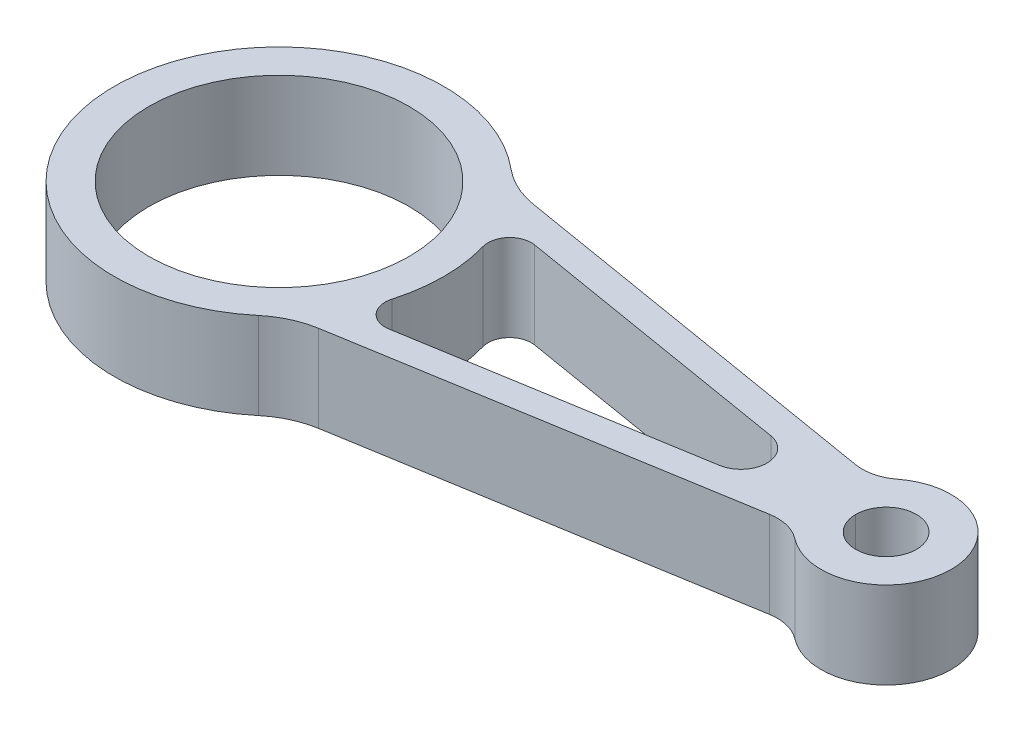
ISO-10303-21;
HEADER;
FILE_DESCRIPTION(('STEP AP214'),'2;1');
FILE_NAME('part.step','',(''),(''),'','','');
FILE_SCHEMA(('AUTOMOTIVE_DESIGN { 1 0 10303 214 1 1 1 1 }'));
ENDSEC;
DATA;
#1=APPLICATION_CONTEXT('core data for automotive mechanical design processes');
#2=APPLICATION_PROTOCOL_DEFINITION('international standard','automotive_design',2000,#1);
#3=PRODUCT_CONTEXT('',#1,'mechanical');
#4=PRODUCT('Part','Part','',(#3));
#5=PRODUCT_RELATED_PRODUCT_CATEGORY('part','',(#4));
#6=PRODUCT_DEFINITION_FORMATION('','',#4);
#7=PRODUCT_DEFINITION_CONTEXT('part definition',#1,'design');
#8=PRODUCT_DEFINITION('design','',#6,#7);
#9=PRODUCT_DEFINITION_SHAPE('','',#8);
#10=(LENGTH_UNIT() NAMED_UNIT(*) SI_UNIT(.MILLI.,.METRE.));
#11=(NAMED_UNIT(*) PLANE_ANGLE_UNIT() SI_UNIT($,.RADIAN.));
#12=(NAMED_UNIT(*) SI_UNIT($,.STERADIAN.) SOLID_ANGLE_UNIT());
#13=UNCERTAINTY_MEASURE_WITH_UNIT(LENGTH_MEASURE(1.E-05),#10,'distance_accuracy_value','');
#14=(GEOMETRIC_REPRESENTATION_CONTEXT(3) GLOBAL_UNCERTAINTY_ASSIGNED_CONTEXT((#13)) GLOBAL_UNIT_ASSIGNED_CONTEXT((#10,
#11,#12)) REPRESENTATION_CONTEXT('',''));
#15=CARTESIAN_POINT('',(0.,0.,0.));
#16=DIRECTION('',(0.,0.,1.));
#17=DIRECTION('',(1.,0.,0.));
#18=AXIS2_PLACEMENT_3D('',#15,#16,#17);
#19=CARTESIAN_POINT('',(140.,10.,0.));
#20=DIRECTION('',(0.,-1.,0.));
#21=DIRECTION('',(0.,0.,-1.));
#22=AXIS2_PLACEMENT_3D('',#19,#20,#21);
#23=CYLINDRICAL_SURFACE('',#22,7.00000000000001);
#24=CARTESIAN_POINT('',(140.,10.,0.));
#25=DIRECTION('',(0.,1.,0.));
#26=DIRECTION('',(0.,0.,1.));
#27=AXIS2_PLACEMENT_3D('',#24,#25,#26);
#28=CIRCLE('',#27,7.00000000000001);
#29=CARTESIAN_POINT('',(147.,10.,0.));
#30=VERTEX_POINT('',#29);
#31=CARTESIAN_POINT('',(133.,10.,0.));
#32=VERTEX_POINT('',#31);
#33=EDGE_CURVE('E211',#30,#32,#28,.T.);
#34=ORIENTED_EDGE('',*,*,#33,.T.);
#35=DIRECTION('',(0.,-1.,0.));
#36=VECTOR('',#35,1.);
#37=CARTESIAN_POINT('',(133.,10.,0.));
#38=LINE('',#37,#36);
#39=CARTESIAN_POINT('',(133.,-10.,0.));
#40=VERTEX_POINT('',#39);
#41=EDGE_CURVE('E11',#32,#40,#38,.T.);
#42=ORIENTED_EDGE('',*,*,#41,.T.);
#43=CARTESIAN_POINT('',(140.,-10.,0.));
#44=DIRECTION('',(0.,1.,0.));
#45=DIRECTION('',(0.,0.,1.));
#46=AXIS2_PLACEMENT_3D('',#43,#44,#45);
#47=CIRCLE('',#46,7.00000000000001);
#48=CARTESIAN_POINT('',(147.,-10.,0.));
#49=VERTEX_POINT('',#48);
#50=EDGE_CURVE('E216',#49,#40,#47,.T.);
#51=ORIENTED_EDGE('',*,*,#50,.F.);
#52=DIRECTION('',(0.,1.,0.));
#53=VECTOR('',#52,1.);
#54=CARTESIAN_POINT('',(147.,10.,0.));
#55=LINE('',#54,#53);
#56=EDGE_CURVE('E52',#49,#30,#55,.T.);
#57=ORIENTED_EDGE('',*,*,#56,.T.);
#58=EDGE_LOOP('',(#34,#42,#51,#57));
#59=FACE_BOUND('',#58,.T.);
#60=ADVANCED_FACE('F43',(#59),#23,.F.);
#61=CARTESIAN_POINT('',(140.,10.,0.));
#62=DIRECTION('',(0.,1.,0.));
#63=DIRECTION('',(0.,0.,1.));
#64=AXIS2_PLACEMENT_3D('',#61,#62,#63);
#65=PLANE('',#64);
#66=CARTESIAN_POINT('',(41.3287506491735,10.,-11.8715782345248));
#67=DIRECTION('',(0.,1.,0.));
#68=DIRECTION('',(0.,0.,1.));
#69=AXIS2_PLACEMENT_3D('',#66,#67,#68);
#70=CIRCLE('',#69,5.);
#71=CARTESIAN_POINT('',(42.1501792206021,10.,-16.8036422144465));
#72=VERTEX_POINT('',#71);
#73=CARTESIAN_POINT('',(36.523081969037,10.,-10.4911621607428));
#74=VERTEX_POINT('',#73);
#75=EDGE_CURVE('E177',#72,#74,#70,.T.);
#76=ORIENTED_EDGE('',*,*,#75,.F.);
#77=DIRECTION('',(0.986412795984335,0.,0.164285714285714));
#78=VECTOR('',#77,1.);
#79=CARTESIAN_POINT('',(42.1501792206021,10.,-16.8036422144465));
#80=LINE('',#79,#78);
#81=CARTESIAN_POINT('',(107.507453416149,10.,-5.91847677590601));
#82=VERTEX_POINT('',#81);
#83=EDGE_CURVE('E193',#72,#82,#80,.T.);
#84=ORIENTED_EDGE('',*,*,#83,.T.);
#85=CARTESIAN_POINT('',(106.521739130435,10.,0.));
#86=DIRECTION('',(0.,-1.,0.));
#87=DIRECTION('',(0.,0.,-1.));
#88=AXIS2_PLACEMENT_3D('',#85,#86,#87);
#89=CIRCLE('',#88,6.);
#90=CARTESIAN_POINT('',(107.507453416149,10.,5.91847677590601));
#91=VERTEX_POINT('',#90);
#92=EDGE_CURVE('E187',#82,#91,#89,.T.);
#93=ORIENTED_EDGE('',*,*,#92,.T.);
#94=DIRECTION('',(-0.986412795984335,0.,0.164285714285714));
#95=VECTOR('',#94,1.);
#96=CARTESIAN_POINT('',(107.507453416149,10.,5.91847677590601));
#97=LINE('',#96,#95);
#98=CARTESIAN_POINT('',(42.1501792206021,10.,16.8036422144465));
#99=VERTEX_POINT('',#98);
#100=EDGE_CURVE('E183',#91,#99,#97,.T.);
#101=ORIENTED_EDGE('',*,*,#100,.T.);
#102=CARTESIAN_POINT('',(41.3287506491735,10.,11.8715782345248));
#103=DIRECTION('',(0.,-1.,0.));
#104=DIRECTION('',(0.,0.,-1.));
#105=AXIS2_PLACEMENT_3D('',#102,#103,#104);
#106=CIRCLE('',#105,5.);
#107=CARTESIAN_POINT('',(36.523081969037,10.,10.4911621607428));
#108=VERTEX_POINT('',#107);
#109=EDGE_CURVE('E159',#99,#108,#106,.T.);
#110=ORIENTED_EDGE('',*,*,#109,.T.);
#111=CARTESIAN_POINT('',(0.,10.,0.));
#112=DIRECTION('',(0.,1.,0.));
#113=DIRECTION('',(0.,0.,1.));
#114=AXIS2_PLACEMENT_3D('',#111,#112,#113);
#115=CIRCLE('',#114,38.);
#116=EDGE_CURVE('E171',#108,#74,#115,.T.);
#117=ORIENTED_EDGE('',*,*,#116,.T.);
#118=EDGE_LOOP('',(#76,#84,#93,#101,#110,#117));
#119=FACE_BOUND('',#118,.T.);
#120=CARTESIAN_POINT('',(0.,10.,0.));
#121=DIRECTION('',(0.,1.,0.));
#122=DIRECTION('',(0.,0.,1.));
#123=AXIS2_PLACEMENT_3D('',#120,#121,#122);
#124=CIRCLE('',#123,30.);
#125=CARTESIAN_POINT('',(0.,10.,30.));
#126=VERTEX_POINT('',#125);
#127=EDGE_CURVE('E220',#126,#126,#124,.T.);
#128=ORIENTED_EDGE('',*,*,#127,.F.);
#129=EDGE_LOOP('',(#128));
#130=FACE_BOUND('',#129,.T.);
#131=CARTESIAN_POINT('',(0.,10.,0.));
#132=DIRECTION('',(0.,1.,0.));
#133=DIRECTION('',(0.,0.,1.));
#134=AXIS2_PLACEMENT_3D('',#131,#132,#133);
#135=CIRCLE('',#134,38.);
#136=CARTESIAN_POINT('',(24.3781675337846,10.,-29.1496989297442));
#137=VERTEX_POINT('',#136);
#138=CARTESIAN_POINT('',(24.3781675337846,10.,29.1496989297442));
#139=VERTEX_POINT('',#138);
#140=EDGE_CURVE('E237',#137,#139,#135,.T.);
#141=ORIENTED_EDGE('',*,*,#140,.T.);
#142=CARTESIAN_POINT('',(37.2087820252501,10.,44.4916457348728));
#143=DIRECTION('',(0.,1.,0.));
#144=DIRECTION('',(0.,0.,1.));
#145=AXIS2_PLACEMENT_3D('',#142,#143,#144);
#146=CIRCLE('',#145,20.);
#147=CARTESIAN_POINT('',(33.9230677395358,10.,24.7633898151861));
#148=VERTEX_POINT('',#147);
#149=EDGE_CURVE('E308',#139,#148,#146,.F.);
#150=ORIENTED_EDGE('',*,*,#149,.T.);
#151=DIRECTION('',(0.986412795984335,0.,-0.164285714285714));
#152=VECTOR('',#151,1.);
#153=CARTESIAN_POINT('',(128.063755469258,10.,9.08438586269532));
#154=LINE('',#153,#152);
#155=CARTESIAN_POINT('',(123.068754783715,10.,9.91629645714703));
#156=VERTEX_POINT('',#155);
#157=EDGE_CURVE('E241',#148,#156,#154,.T.);
#158=ORIENTED_EDGE('',*,*,#157,.T.);
#159=CARTESIAN_POINT('',(124.711611926572,10.,19.7804244169904));
#160=DIRECTION('',(0.,1.,0.));
#161=DIRECTION('',(0.,0.,1.));
#162=AXIS2_PLACEMENT_3D('',#159,#160,#161);
#163=CIRCLE('',#162,10.);
#164=CARTESIAN_POINT('',(130.826967155943,10.,11.8682546501942));
#165=VERTEX_POINT('',#164);
#166=EDGE_CURVE('E282',#156,#165,#163,.F.);
#167=ORIENTED_EDGE('',*,*,#166,.T.);
#168=CARTESIAN_POINT('',(140.,10.,0.));
#169=DIRECTION('',(0.,1.,0.));
#170=DIRECTION('',(0.,0.,1.));
#171=AXIS2_PLACEMENT_3D('',#168,#169,#170);
#172=CIRCLE('',#171,15.);
#173=CARTESIAN_POINT('',(130.826967155943,10.,-11.8682546501942));
#174=VERTEX_POINT('',#173);
#175=EDGE_CURVE('E228',#165,#174,#172,.T.);
#176=ORIENTED_EDGE('',*,*,#175,.T.);
#177=CARTESIAN_POINT('',(124.711611926572,10.,-19.7804244169904));
#178=DIRECTION('',(0.,1.,0.));
#179=DIRECTION('',(0.,0.,1.));
#180=AXIS2_PLACEMENT_3D('',#177,#178,#179);
#181=CIRCLE('',#180,10.);
#182=CARTESIAN_POINT('',(123.068754783715,10.,-9.91629645714703));
#183=VERTEX_POINT('',#182);
#184=EDGE_CURVE('E275',#174,#183,#181,.F.);
#185=ORIENTED_EDGE('',*,*,#184,.T.);
#186=DIRECTION('',(-0.986412795984335,0.,-0.164285714285714));
#187=VECTOR('',#186,1.);
#188=CARTESIAN_POINT('',(128.063755469258,10.,-9.08438586269532));
#189=LINE('',#188,#187);
#190=CARTESIAN_POINT('',(33.9230677395358,10.,-24.7633898151861));
#191=VERTEX_POINT('',#190);
#192=EDGE_CURVE('E232',#183,#191,#189,.T.);
#193=ORIENTED_EDGE('',*,*,#192,.T.);
#194=CARTESIAN_POINT('',(37.2087820252501,10.,-44.4916457348728));
#195=DIRECTION('',(0.,1.,0.));
#196=DIRECTION('',(0.,0.,1.));
#197=AXIS2_PLACEMENT_3D('',#194,#195,#196);
#198=CIRCLE('',#197,20.);
#199=EDGE_CURVE('E302',#191,#137,#198,.F.);
#200=ORIENTED_EDGE('',*,*,#199,.T.);
#201=EDGE_LOOP('',(#141,#150,#158,#167,#176,#185,#193,#200));
#202=FACE_BOUND('',#201,.T.);
#203=ORIENTED_EDGE('',*,*,#33,.F.);
#204=EDGE_CURVE('E215',#32,#30,#28,.T.);
#205=ORIENTED_EDGE('',*,*,#204,.F.);
#206=EDGE_LOOP('',(#203,#205));
#207=FACE_BOUND('',#206,.T.);
#208=ADVANCED_FACE('F179',(#119,#130,#202,#207),#65,.T.);
#209=CARTESIAN_POINT('',(140.,-10.,0.));
#210=DIRECTION('',(0.,1.,0.));
#211=DIRECTION('',(0.,0.,1.));
#212=AXIS2_PLACEMENT_3D('',#209,#210,#211);
#213=PLANE('',#212);
#214=DIRECTION('',(0.986412795984335,0.,0.164285714285714));
#215=VECTOR('',#214,1.);
#216=CARTESIAN_POINT('',(140.082142857143,-10.,-0.493206397992192));
#217=LINE('',#216,#215);
#218=CARTESIAN_POINT('',(42.1501792206021,-10.,-16.8036422144465));
#219=VERTEX_POINT('',#218);
#220=CARTESIAN_POINT('',(107.507453416149,-10.,-5.91847677590601));
#221=VERTEX_POINT('',#220);
#222=EDGE_CURVE('E322',#219,#221,#217,.T.);
#223=ORIENTED_EDGE('',*,*,#222,.F.);
#224=CARTESIAN_POINT('',(41.3287506491735,-10.,-11.8715782345248));
#225=DIRECTION('',(0.,1.,0.));
#226=DIRECTION('',(0.,0.,1.));
#227=AXIS2_PLACEMENT_3D('',#224,#225,#226);
#228=CIRCLE('',#227,5.);
#229=CARTESIAN_POINT('',(36.523081969037,-10.,-10.4911621607428));
#230=VERTEX_POINT('',#229);
#231=EDGE_CURVE('E325',#219,#230,#228,.T.);
#232=ORIENTED_EDGE('',*,*,#231,.T.);
#233=CARTESIAN_POINT('',(0.,-10.,0.));
#234=DIRECTION('',(0.,1.,0.));
#235=DIRECTION('',(0.,0.,1.));
#236=AXIS2_PLACEMENT_3D('',#233,#234,#235);
#237=CIRCLE('',#236,38.);
#238=CARTESIAN_POINT('',(36.523081969037,-10.,10.4911621607428));
#239=VERTEX_POINT('',#238);
#240=EDGE_CURVE('E311',#239,#230,#237,.T.);
#241=ORIENTED_EDGE('',*,*,#240,.F.);
#242=CARTESIAN_POINT('',(41.3287506491735,-10.,11.8715782345248));
#243=DIRECTION('',(0.,1.,0.));
#244=DIRECTION('',(0.,0.,1.));
#245=AXIS2_PLACEMENT_3D('',#242,#243,#244);
#246=CIRCLE('',#245,5.);
#247=CARTESIAN_POINT('',(42.1501792206021,-10.,16.8036422144465));
#248=VERTEX_POINT('',#247);
#249=EDGE_CURVE('E162',#248,#239,#246,.F.);
#250=ORIENTED_EDGE('',*,*,#249,.F.);
#251=DIRECTION('',(-0.986412795984335,0.,0.164285714285714));
#252=VECTOR('',#251,1.);
#253=CARTESIAN_POINT('',(140.082142857143,-10.,0.493206397992189));
#254=LINE('',#253,#252);
#255=CARTESIAN_POINT('',(107.507453416149,-10.,5.91847677590601));
#256=VERTEX_POINT('',#255);
#257=EDGE_CURVE('E316',#256,#248,#254,.T.);
#258=ORIENTED_EDGE('',*,*,#257,.F.);
#259=CARTESIAN_POINT('',(106.521739130435,-10.,0.));
#260=DIRECTION('',(0.,1.,0.));
#261=DIRECTION('',(0.,0.,1.));
#262=AXIS2_PLACEMENT_3D('',#259,#260,#261);
#263=CIRCLE('',#262,6.);
#264=EDGE_CURVE('E319',#221,#256,#263,.F.);
#265=ORIENTED_EDGE('',*,*,#264,.F.);
#266=EDGE_LOOP('',(#223,#232,#241,#250,#258,#265));
#267=FACE_BOUND('',#266,.T.);
#268=CARTESIAN_POINT('',(140.,-10.,0.));
#269=DIRECTION('',(0.,1.,0.));
#270=DIRECTION('',(0.,0.,1.));
#271=AXIS2_PLACEMENT_3D('',#268,#269,#270);
#272=CIRCLE('',#271,15.);
#273=CARTESIAN_POINT('',(130.826967155943,-10.,11.8682546501942));
#274=VERTEX_POINT('',#273);
#275=CARTESIAN_POINT('',(130.826967155943,-10.,-11.8682546501942));
#276=VERTEX_POINT('',#275);
#277=EDGE_CURVE('E224',#274,#276,#272,.T.);
#278=ORIENTED_EDGE('',*,*,#277,.F.);
#279=CARTESIAN_POINT('',(124.711611926572,-10.,19.7804244169904));
#280=DIRECTION('',(0.,1.,0.));
#281=DIRECTION('',(0.,0.,1.));
#282=AXIS2_PLACEMENT_3D('',#279,#280,#281);
#283=CIRCLE('',#282,10.);
#284=CARTESIAN_POINT('',(123.068754783715,-10.,9.91629645714703));
#285=VERTEX_POINT('',#284);
#286=EDGE_CURVE('E278',#274,#285,#283,.T.);
#287=ORIENTED_EDGE('',*,*,#286,.T.);
#288=DIRECTION('',(0.986412795984335,0.,-0.164285714285714));
#289=VECTOR('',#288,1.);
#290=CARTESIAN_POINT('',(128.063755469258,-10.,9.08438586269532));
#291=LINE('',#290,#289);
#292=CARTESIAN_POINT('',(33.9230677395358,-10.,24.7633898151861));
#293=VERTEX_POINT('',#292);
#294=EDGE_CURVE('E233',#293,#285,#291,.T.);
#295=ORIENTED_EDGE('',*,*,#294,.F.);
#296=CARTESIAN_POINT('',(37.2087820252501,-10.,44.4916457348728));
#297=DIRECTION('',(0.,1.,0.));
#298=DIRECTION('',(0.,0.,1.));
#299=AXIS2_PLACEMENT_3D('',#296,#297,#298);
#300=CIRCLE('',#299,20.);
#301=CARTESIAN_POINT('',(24.3781675337846,-10.,29.1496989297442));
#302=VERTEX_POINT('',#301);
#303=EDGE_CURVE('E305',#293,#302,#300,.T.);
#304=ORIENTED_EDGE('',*,*,#303,.T.);
#305=CARTESIAN_POINT('',(0.,-10.,0.));
#306=DIRECTION('',(0.,1.,0.));
#307=DIRECTION('',(0.,0.,1.));
#308=AXIS2_PLACEMENT_3D('',#305,#306,#307);
#309=CIRCLE('',#308,38.);
#310=CARTESIAN_POINT('',(24.3781675337846,-10.,-29.1496989297442));
#311=VERTEX_POINT('',#310);
#312=EDGE_CURVE('E252',#311,#302,#309,.T.);
#313=ORIENTED_EDGE('',*,*,#312,.F.);
#314=CARTESIAN_POINT('',(37.2087820252501,-10.,-44.4916457348728));
#315=DIRECTION('',(0.,1.,0.));
#316=DIRECTION('',(0.,0.,1.));
#317=AXIS2_PLACEMENT_3D('',#314,#315,#316);
#318=CIRCLE('',#317,20.);
#319=CARTESIAN_POINT('',(33.9230677395358,-10.,-24.7633898151861));
#320=VERTEX_POINT('',#319);
#321=EDGE_CURVE('E299',#311,#320,#318,.T.);
#322=ORIENTED_EDGE('',*,*,#321,.T.);
#323=DIRECTION('',(-0.986412795984335,0.,-0.164285714285714));
#324=VECTOR('',#323,1.);
#325=CARTESIAN_POINT('',(128.063755469258,-10.,-9.08438586269532));
#326=LINE('',#325,#324);
#327=CARTESIAN_POINT('',(123.068754783715,-10.,-9.91629645714703));
#328=VERTEX_POINT('',#327);
#329=EDGE_CURVE('E248',#328,#320,#326,.T.);
#330=ORIENTED_EDGE('',*,*,#329,.F.);
#331=CARTESIAN_POINT('',(124.711611926572,-10.,-19.7804244169904));
#332=DIRECTION('',(0.,1.,0.));
#333=DIRECTION('',(0.,0.,1.));
#334=AXIS2_PLACEMENT_3D('',#331,#332,#333);
#335=CIRCLE('',#334,10.);
#336=EDGE_CURVE('E272',#328,#276,#335,.T.);
#337=ORIENTED_EDGE('',*,*,#336,.T.);
#338=EDGE_LOOP('',(#278,#287,#295,#304,#313,#322,#330,#337));
#339=FACE_BOUND('',#338,.T.);
#340=CARTESIAN_POINT('',(0.,-10.,0.));
#341=DIRECTION('',(0.,1.,0.));
#342=DIRECTION('',(0.,0.,1.));
#343=AXIS2_PLACEMENT_3D('',#340,#341,#342);
#344=CIRCLE('',#343,30.);
#345=CARTESIAN_POINT('',(0.,-10.,30.));
#346=VERTEX_POINT('',#345);
#347=EDGE_CURVE('E214',#346,#346,#344,.T.);
#348=ORIENTED_EDGE('',*,*,#347,.T.);
#349=EDGE_LOOP('',(#348));
#350=FACE_BOUND('',#349,.T.);
#351=ORIENTED_EDGE('',*,*,#50,.T.);
#352=EDGE_CURVE('E200',#40,#49,#47,.T.);
#353=ORIENTED_EDGE('',*,*,#352,.T.);
#354=EDGE_LOOP('',(#351,#353));
#355=FACE_BOUND('',#354,.T.);
#356=ADVANCED_FACE('F337',(#267,#339,#350,#355),#213,.F.);
#357=CARTESIAN_POINT('',(140.,10.,0.));
#358=DIRECTION('',(0.,-1.,0.));
#359=DIRECTION('',(0.,0.,-1.));
#360=AXIS2_PLACEMENT_3D('',#357,#358,#359);
#361=CYLINDRICAL_SURFACE('',#360,15.);
#362=ORIENTED_EDGE('',*,*,#277,.T.);
#363=DIRECTION('',(0.,-1.,0.));
#364=VECTOR('',#363,1.);
#365=CARTESIAN_POINT('',(130.826967155943,10.,-11.8682546501942));
#366=LINE('',#365,#364);
#367=EDGE_CURVE('E265',#276,#174,#366,.F.);
#368=ORIENTED_EDGE('',*,*,#367,.T.);
#369=ORIENTED_EDGE('',*,*,#175,.F.);
#370=DIRECTION('',(0.,-1.,0.));
#371=VECTOR('',#370,1.);
#372=CARTESIAN_POINT('',(130.826967155943,10.,11.8682546501942));
#373=LINE('',#372,#371);
#374=EDGE_CURVE('E261',#165,#274,#373,.T.);
#375=ORIENTED_EDGE('',*,*,#374,.T.);
#376=EDGE_LOOP('',(#362,#368,#369,#375));
#377=FACE_BOUND('',#376,.T.);
#378=ADVANCED_FACE('F362',(#377),#361,.T.);
#379=CARTESIAN_POINT('',(128.063755469258,10.,-9.08438586269532));
#380=DIRECTION('',(-0.164285714285714,0.,0.986412795984335));
#381=DIRECTION('',(0.986412795984335,0.,0.164285714285714));
#382=AXIS2_PLACEMENT_3D('',#379,#380,#381);
#383=PLANE('',#382);
#384=ORIENTED_EDGE('',*,*,#329,.T.);
#385=DIRECTION('',(0.,1.,0.));
#386=VECTOR('',#385,1.);
#387=CARTESIAN_POINT('',(33.9230677395358,10.,-24.7633898151861));
#388=LINE('',#387,#386);
#389=EDGE_CURVE('E292',#320,#191,#388,.T.);
#390=ORIENTED_EDGE('',*,*,#389,.T.);
#391=ORIENTED_EDGE('',*,*,#192,.F.);
#392=DIRECTION('',(0.,1.,0.));
#393=VECTOR('',#392,1.);
#394=CARTESIAN_POINT('',(123.068754783715,-10.,-9.91629645714703));
#395=LINE('',#394,#393);
#396=EDGE_CURVE('E244',#183,#328,#395,.F.);
#397=ORIENTED_EDGE('',*,*,#396,.T.);
#398=EDGE_LOOP('',(#384,#390,#391,#397));
#399=FACE_BOUND('',#398,.T.);
#400=ADVANCED_FACE('F372',(#399),#383,.F.);
#401=CARTESIAN_POINT('',(0.,10.,0.));
#402=DIRECTION('',(0.,-1.,0.));
#403=DIRECTION('',(0.,0.,-1.));
#404=AXIS2_PLACEMENT_3D('',#401,#402,#403);
#405=CYLINDRICAL_SURFACE('',#404,38.);
#406=ORIENTED_EDGE('',*,*,#140,.F.);
#407=DIRECTION('',(0.,-1.,0.));
#408=VECTOR('',#407,1.);
#409=CARTESIAN_POINT('',(24.3781675337846,10.,-29.1496989297442));
#410=LINE('',#409,#408);
#411=EDGE_CURVE('E288',#137,#311,#410,.T.);
#412=ORIENTED_EDGE('',*,*,#411,.T.);
#413=ORIENTED_EDGE('',*,*,#312,.T.);
#414=DIRECTION('',(0.,-1.,0.));
#415=VECTOR('',#414,1.);
#416=CARTESIAN_POINT('',(24.3781675337846,10.,29.1496989297442));
#417=LINE('',#416,#415);
#418=EDGE_CURVE('E285',#302,#139,#417,.F.);
#419=ORIENTED_EDGE('',*,*,#418,.T.);
#420=EDGE_LOOP('',(#406,#412,#413,#419));
#421=FACE_BOUND('',#420,.T.);
#422=ADVANCED_FACE('F368',(#421),#405,.T.);
#423=CARTESIAN_POINT('',(128.063755469258,10.,9.08438586269532));
#424=DIRECTION('',(-0.164285714285714,0.,-0.986412795984335));
#425=DIRECTION('',(-0.986412795984335,0.,0.164285714285714));
#426=AXIS2_PLACEMENT_3D('',#423,#424,#425);
#427=PLANE('',#426);
#428=ORIENTED_EDGE('',*,*,#157,.F.);
#429=DIRECTION('',(0.,1.,0.));
#430=VECTOR('',#429,1.);
#431=CARTESIAN_POINT('',(33.9230677395358,-10.,24.7633898151861));
#432=LINE('',#431,#430);
#433=EDGE_CURVE('E295',#148,#293,#432,.F.);
#434=ORIENTED_EDGE('',*,*,#433,.T.);
#435=ORIENTED_EDGE('',*,*,#294,.T.);
#436=DIRECTION('',(0.,1.,0.));
#437=VECTOR('',#436,1.);
#438=CARTESIAN_POINT('',(123.068754783715,10.,9.91629645714703));
#439=LINE('',#438,#437);
#440=EDGE_CURVE('E268',#285,#156,#439,.T.);
#441=ORIENTED_EDGE('',*,*,#440,.T.);
#442=EDGE_LOOP('',(#428,#434,#435,#441));
#443=FACE_BOUND('',#442,.T.);
#444=ADVANCED_FACE('F350',(#443),#427,.F.);
#445=CARTESIAN_POINT('',(0.,10.,0.));
#446=DIRECTION('',(0.,-1.,0.));
#447=DIRECTION('',(0.,0.,-1.));
#448=AXIS2_PLACEMENT_3D('',#445,#446,#447);
#449=CYLINDRICAL_SURFACE('',#448,30.);
#450=ORIENTED_EDGE('',*,*,#127,.T.);
#451=EDGE_LOOP('',(#450));
#452=FACE_BOUND('',#451,.T.);
#453=ORIENTED_EDGE('',*,*,#347,.F.);
#454=EDGE_LOOP('',(#453));
#455=FACE_BOUND('',#454,.T.);
#456=ADVANCED_FACE('F341',(#452,#455),#449,.F.);
#457=ORIENTED_EDGE('',*,*,#41,.F.);
#458=ORIENTED_EDGE('',*,*,#204,.T.);
#459=ORIENTED_EDGE('',*,*,#56,.F.);
#460=ORIENTED_EDGE('',*,*,#352,.F.);
#461=EDGE_LOOP('',(#457,#458,#459,#460));
#462=FACE_BOUND('',#461,.T.);
#463=ADVANCED_FACE('F338',(#462),#23,.F.);
#464=CARTESIAN_POINT('',(124.711611926572,10.,-19.7804244169904));
#465=DIRECTION('',(0.,-1.,0.));
#466=DIRECTION('',(0.,0.,-1.));
#467=AXIS2_PLACEMENT_3D('',#464,#465,#466);
#468=CYLINDRICAL_SURFACE('',#467,10.);
#469=ORIENTED_EDGE('',*,*,#184,.F.);
#470=ORIENTED_EDGE('',*,*,#367,.F.);
#471=ORIENTED_EDGE('',*,*,#336,.F.);
#472=ORIENTED_EDGE('',*,*,#396,.F.);
#473=EDGE_LOOP('',(#469,#470,#471,#472));
#474=FACE_BOUND('',#473,.T.);
#475=ADVANCED_FACE('F340',(#474),#468,.F.);
#476=CARTESIAN_POINT('',(124.711611926572,10.,19.7804244169904));
#477=DIRECTION('',(0.,-1.,0.));
#478=DIRECTION('',(0.,0.,-1.));
#479=AXIS2_PLACEMENT_3D('',#476,#477,#478);
#480=CYLINDRICAL_SURFACE('',#479,10.);
#481=ORIENTED_EDGE('',*,*,#166,.F.);
#482=ORIENTED_EDGE('',*,*,#440,.F.);
#483=ORIENTED_EDGE('',*,*,#286,.F.);
#484=ORIENTED_EDGE('',*,*,#374,.F.);
#485=EDGE_LOOP('',(#481,#482,#483,#484));
#486=FACE_BOUND('',#485,.T.);
#487=ADVANCED_FACE('F347',(#486),#480,.F.);
#488=CARTESIAN_POINT('',(37.2087820252501,10.,-44.4916457348728));
#489=DIRECTION('',(0.,-1.,0.));
#490=DIRECTION('',(0.,0.,-1.));
#491=AXIS2_PLACEMENT_3D('',#488,#489,#490);
#492=CYLINDRICAL_SURFACE('',#491,20.);
#493=ORIENTED_EDGE('',*,*,#199,.F.);
#494=ORIENTED_EDGE('',*,*,#389,.F.);
#495=ORIENTED_EDGE('',*,*,#321,.F.);
#496=ORIENTED_EDGE('',*,*,#411,.F.);
#497=EDGE_LOOP('',(#493,#494,#495,#496));
#498=FACE_BOUND('',#497,.T.);
#499=ADVANCED_FACE('F381',(#498),#492,.F.);
#500=CARTESIAN_POINT('',(37.2087820252501,10.,44.4916457348728));
#501=DIRECTION('',(0.,-1.,0.));
#502=DIRECTION('',(0.,0.,-1.));
#503=AXIS2_PLACEMENT_3D('',#500,#501,#502);
#504=CYLINDRICAL_SURFACE('',#503,20.);
#505=ORIENTED_EDGE('',*,*,#149,.F.);
#506=ORIENTED_EDGE('',*,*,#418,.F.);
#507=ORIENTED_EDGE('',*,*,#303,.F.);
#508=ORIENTED_EDGE('',*,*,#433,.F.);
#509=EDGE_LOOP('',(#505,#506,#507,#508));
#510=FACE_BOUND('',#509,.T.);
#511=ADVANCED_FACE('F45',(#510),#504,.F.);
#512=CARTESIAN_POINT('',(41.3287506491735,-55.,-11.8715782345248));
#513=DIRECTION('',(0.,1.,0.));
#514=DIRECTION('',(0.,0.,1.));
#515=AXIS2_PLACEMENT_3D('',#512,#513,#514);
#516=CYLINDRICAL_SURFACE('',#515,5.);
#517=DIRECTION('',(0.,1.,0.));
#518=VECTOR('',#517,1.);
#519=CARTESIAN_POINT('',(42.1501792206021,-55.,-16.8036422144465));
#520=LINE('',#519,#518);
#521=EDGE_CURVE('E197',#219,#72,#520,.T.);
#522=ORIENTED_EDGE('',*,*,#521,.T.);
#523=ORIENTED_EDGE('',*,*,#75,.T.);
#524=DIRECTION('',(0.,1.,0.));
#525=VECTOR('',#524,1.);
#526=CARTESIAN_POINT('',(36.523081969037,-55.,-10.4911621607428));
#527=LINE('',#526,#525);
#528=EDGE_CURVE('E167',#230,#74,#527,.T.);
#529=ORIENTED_EDGE('',*,*,#528,.F.);
#530=ORIENTED_EDGE('',*,*,#231,.F.);
#531=EDGE_LOOP('',(#522,#523,#529,#530));
#532=FACE_BOUND('',#531,.T.);
#533=ADVANCED_FACE('F388',(#532),#516,.F.);
#534=CARTESIAN_POINT('',(42.1501792206021,-55.,-16.8036422144465));
#535=DIRECTION('',(-0.164285714285714,0.,0.986412795984335));
#536=DIRECTION('',(0.986412795984335,0.,0.164285714285714));
#537=AXIS2_PLACEMENT_3D('',#534,#535,#536);
#538=PLANE('',#537);
#539=ORIENTED_EDGE('',*,*,#222,.T.);
#540=DIRECTION('',(0.,1.,0.));
#541=VECTOR('',#540,1.);
#542=CARTESIAN_POINT('',(107.507453416149,-55.,-5.91847677590601));
#543=LINE('',#542,#541);
#544=EDGE_CURVE('E201',#221,#82,#543,.T.);
#545=ORIENTED_EDGE('',*,*,#544,.T.);
#546=ORIENTED_EDGE('',*,*,#83,.F.);
#547=ORIENTED_EDGE('',*,*,#521,.F.);
#548=EDGE_LOOP('',(#539,#545,#546,#547));
#549=FACE_BOUND('',#548,.T.);
#550=ADVANCED_FACE('F418',(#549),#538,.T.);
#551=CARTESIAN_POINT('',(106.521739130435,-55.,0.));
#552=DIRECTION('',(0.,1.,0.));
#553=DIRECTION('',(0.,0.,1.));
#554=AXIS2_PLACEMENT_3D('',#551,#552,#553);
#555=CYLINDRICAL_SURFACE('',#554,6.);
#556=ORIENTED_EDGE('',*,*,#264,.T.);
#557=DIRECTION('',(0.,1.,0.));
#558=VECTOR('',#557,1.);
#559=CARTESIAN_POINT('',(107.507453416149,-55.,5.91847677590601));
#560=LINE('',#559,#558);
#561=EDGE_CURVE('E204',#256,#91,#560,.T.);
#562=ORIENTED_EDGE('',*,*,#561,.T.);
#563=ORIENTED_EDGE('',*,*,#92,.F.);
#564=ORIENTED_EDGE('',*,*,#544,.F.);
#565=EDGE_LOOP('',(#556,#562,#563,#564));
#566=FACE_BOUND('',#565,.T.);
#567=ADVANCED_FACE('F423',(#566),#555,.F.);
#568=CARTESIAN_POINT('',(107.507453416149,-55.,5.91847677590601));
#569=DIRECTION('',(-0.164285714285714,0.,-0.986412795984335));
#570=DIRECTION('',(-0.986412795984335,0.,0.164285714285714));
#571=AXIS2_PLACEMENT_3D('',#568,#569,#570);
#572=PLANE('',#571);
#573=ORIENTED_EDGE('',*,*,#257,.T.);
#574=DIRECTION('',(0.,1.,0.));
#575=VECTOR('',#574,1.);
#576=CARTESIAN_POINT('',(42.1501792206021,-55.,16.8036422144465));
#577=LINE('',#576,#575);
#578=EDGE_CURVE('E166',#248,#99,#577,.T.);
#579=ORIENTED_EDGE('',*,*,#578,.T.);
#580=ORIENTED_EDGE('',*,*,#100,.F.);
#581=ORIENTED_EDGE('',*,*,#561,.F.);
#582=EDGE_LOOP('',(#573,#579,#580,#581));
#583=FACE_BOUND('',#582,.T.);
#584=ADVANCED_FACE('F431',(#583),#572,.T.);
#585=CARTESIAN_POINT('',(41.3287506491735,-55.,11.8715782345248));
#586=DIRECTION('',(0.,1.,0.));
#587=DIRECTION('',(0.,0.,1.));
#588=AXIS2_PLACEMENT_3D('',#585,#586,#587);
#589=CYLINDRICAL_SURFACE('',#588,5.);
#590=ORIENTED_EDGE('',*,*,#249,.T.);
#591=DIRECTION('',(0.,1.,0.));
#592=VECTOR('',#591,1.);
#593=CARTESIAN_POINT('',(36.523081969037,-55.,10.4911621607428));
#594=LINE('',#593,#592);
#595=EDGE_CURVE('E154',#239,#108,#594,.T.);
#596=ORIENTED_EDGE('',*,*,#595,.T.);
#597=ORIENTED_EDGE('',*,*,#109,.F.);
#598=ORIENTED_EDGE('',*,*,#578,.F.);
#599=EDGE_LOOP('',(#590,#596,#597,#598));
#600=FACE_BOUND('',#599,.T.);
#601=ADVANCED_FACE('F156',(#600),#589,.F.);
#602=CARTESIAN_POINT('',(0.,-55.,0.));
#603=DIRECTION('',(0.,1.,0.));
#604=DIRECTION('',(0.,0.,1.));
#605=AXIS2_PLACEMENT_3D('',#602,#603,#604);
#606=CYLINDRICAL_SURFACE('',#605,38.);
#607=ORIENTED_EDGE('',*,*,#240,.T.);
#608=ORIENTED_EDGE('',*,*,#528,.T.);
#609=ORIENTED_EDGE('',*,*,#116,.F.);
#610=ORIENTED_EDGE('',*,*,#595,.F.);
#611=EDGE_LOOP('',(#607,#608,#609,#610));
#612=FACE_BOUND('',#611,.T.);
#613=ADVANCED_FACE('F172',(#612),#606,.T.);
#614=CLOSED_SHELL('',(#60,#208,#356,#378,#400,#422,#444,#456,#463,#475,#487,#499,#511,#533,#550,
#567,#584,#601,#613));
#615=MANIFOLD_SOLID_BREP('B2',#614);
#616=ADVANCED_BREP_SHAPE_REPRESENTATION('',(#18,#615),#14);
#617=SHAPE_DEFINITION_REPRESENTATION(#9,#616);
ENDSEC;
END-ISO-10303-21;
